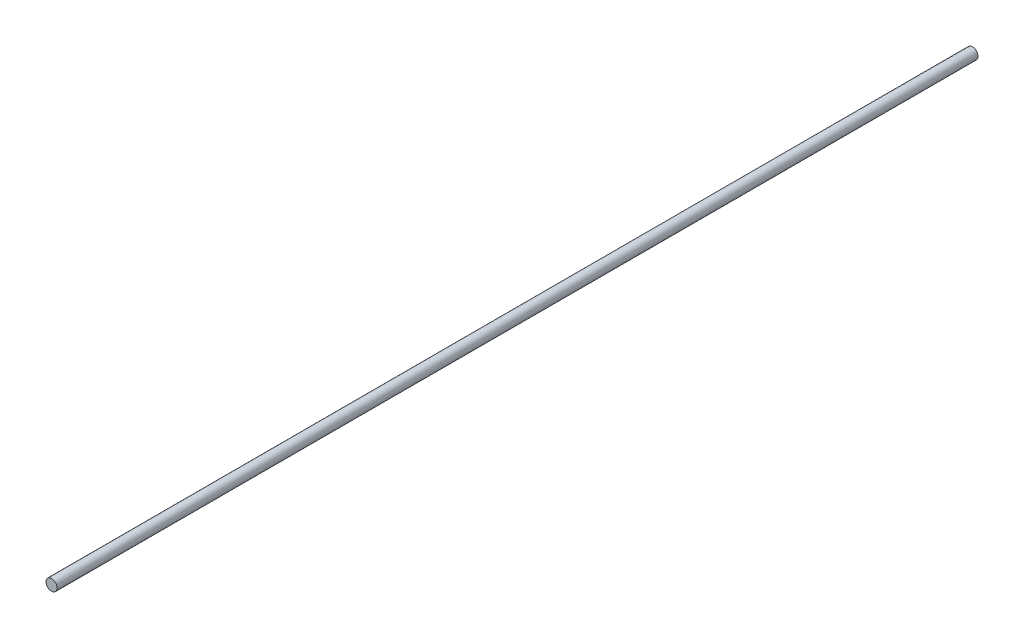
ISO-10303-21;
HEADER;
FILE_DESCRIPTION(('STEP AP214'),'2;1');
FILE_NAME('part.step','',(''),(''),'','','');
FILE_SCHEMA(('AUTOMOTIVE_DESIGN { 1 0 10303 214 1 1 1 1 }'));
ENDSEC;
DATA;
#1=APPLICATION_CONTEXT('core data for automotive mechanical design processes');
#2=APPLICATION_PROTOCOL_DEFINITION('international standard','automotive_design',2000,#1);
#3=PRODUCT_CONTEXT('',#1,'mechanical');
#4=PRODUCT('Part','Part','',(#3));
#5=PRODUCT_RELATED_PRODUCT_CATEGORY('part','',(#4));
#6=PRODUCT_DEFINITION_FORMATION('','',#4);
#7=PRODUCT_DEFINITION_CONTEXT('part definition',#1,'design');
#8=PRODUCT_DEFINITION('design','',#6,#7);
#9=PRODUCT_DEFINITION_SHAPE('','',#8);
#10=(LENGTH_UNIT() NAMED_UNIT(*) SI_UNIT(.MILLI.,.METRE.));
#11=(NAMED_UNIT(*) PLANE_ANGLE_UNIT() SI_UNIT($,.RADIAN.));
#12=(NAMED_UNIT(*) SI_UNIT($,.STERADIAN.) SOLID_ANGLE_UNIT());
#13=UNCERTAINTY_MEASURE_WITH_UNIT(LENGTH_MEASURE(1.E-05),#10,'distance_accuracy_value','');
#14=(GEOMETRIC_REPRESENTATION_CONTEXT(3) GLOBAL_UNCERTAINTY_ASSIGNED_CONTEXT((#13)) GLOBAL_UNIT_ASSIGNED_CONTEXT((#10,
#11,#12)) REPRESENTATION_CONTEXT('',''));
#15=CARTESIAN_POINT('',(0.,0.,0.));
#16=DIRECTION('',(0.,0.,1.));
#17=DIRECTION('',(1.,0.,0.));
#18=AXIS2_PLACEMENT_3D('',#15,#16,#17);
#19=CARTESIAN_POINT('',(0.,0.,1625.));
#20=DIRECTION('',(0.,0.,-1.));
#21=DIRECTION('',(-1.,0.,0.));
#22=AXIS2_PLACEMENT_3D('',#19,#20,#21);
#23=CYLINDRICAL_SURFACE('',#22,9.779);
#24=CARTESIAN_POINT('',(0.,0.,1625.));
#25=DIRECTION('',(0.,0.,1.));
#26=DIRECTION('',(1.,0.,0.));
#27=AXIS2_PLACEMENT_3D('',#24,#25,#26);
#28=CIRCLE('',#27,9.779);
#29=CARTESIAN_POINT('',(9.779,0.,1625.));
#30=VERTEX_POINT('',#29);
#31=EDGE_CURVE('E10',#30,#30,#28,.T.);
#32=ORIENTED_EDGE('',*,*,#31,.F.);
#33=EDGE_LOOP('',(#32));
#34=FACE_BOUND('',#33,.T.);
#35=CARTESIAN_POINT('',(0.,0.,0.));
#36=DIRECTION('',(0.,0.,1.));
#37=DIRECTION('',(1.,0.,0.));
#38=AXIS2_PLACEMENT_3D('',#35,#36,#37);
#39=CIRCLE('',#38,9.779);
#40=CARTESIAN_POINT('',(9.779,0.,0.));
#41=VERTEX_POINT('',#40);
#42=EDGE_CURVE('E34',#41,#41,#39,.T.);
#43=ORIENTED_EDGE('',*,*,#42,.T.);
#44=EDGE_LOOP('',(#43));
#45=FACE_BOUND('',#44,.T.);
#46=ADVANCED_FACE('F31',(#34,#45),#23,.T.);
#47=CARTESIAN_POINT('',(0.,0.,1625.));
#48=DIRECTION('',(0.,0.,1.));
#49=DIRECTION('',(1.,0.,0.));
#50=AXIS2_PLACEMENT_3D('',#47,#48,#49);
#51=PLANE('',#50);
#52=ORIENTED_EDGE('',*,*,#31,.T.);
#53=EDGE_LOOP('',(#52));
#54=FACE_BOUND('',#53,.T.);
#55=ADVANCED_FACE('F46',(#54),#51,.T.);
#56=CARTESIAN_POINT('',(0.,0.,0.));
#57=DIRECTION('',(0.,0.,1.));
#58=DIRECTION('',(1.,0.,0.));
#59=AXIS2_PLACEMENT_3D('',#56,#57,#58);
#60=PLANE('',#59);
#61=ORIENTED_EDGE('',*,*,#42,.F.);
#62=EDGE_LOOP('',(#61));
#63=FACE_BOUND('',#62,.T.);
#64=ADVANCED_FACE('F44',(#63),#60,.F.);
#65=CLOSED_SHELL('',(#46,#55,#64));
#66=MANIFOLD_SOLID_BREP('B2',#65);
#67=ADVANCED_BREP_SHAPE_REPRESENTATION('',(#18,#66),#14);
#68=SHAPE_DEFINITION_REPRESENTATION(#9,#67);
ENDSEC;
END-ISO-10303-21;
